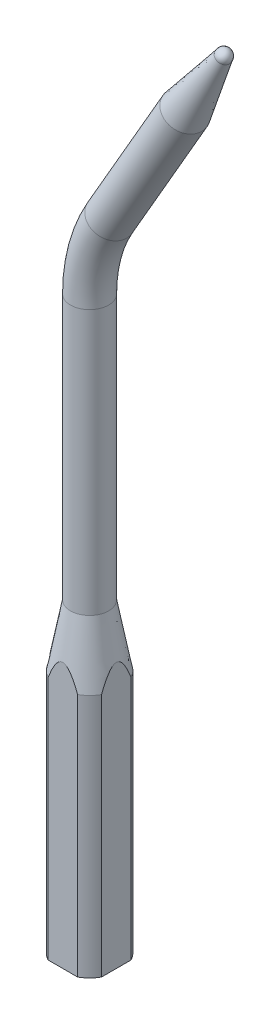
ISO-10303-21;
HEADER;
FILE_DESCRIPTION(('STEP AP214'),'2;1');
FILE_NAME('part.step','',(''),(''),'','','');
FILE_SCHEMA(('AUTOMOTIVE_DESIGN { 1 0 10303 214 1 1 1 1 }'));
ENDSEC;
DATA;
#1=APPLICATION_CONTEXT('core data for automotive mechanical design processes');
#2=APPLICATION_PROTOCOL_DEFINITION('international standard','automotive_design',2000,#1);
#3=PRODUCT_CONTEXT('',#1,'mechanical');
#4=PRODUCT('Part','Part','',(#3));
#5=PRODUCT_RELATED_PRODUCT_CATEGORY('part','',(#4));
#6=PRODUCT_DEFINITION_FORMATION('','',#4);
#7=PRODUCT_DEFINITION_CONTEXT('part definition',#1,'design');
#8=PRODUCT_DEFINITION('design','',#6,#7);
#9=PRODUCT_DEFINITION_SHAPE('','',#8);
#10=(LENGTH_UNIT() NAMED_UNIT(*) SI_UNIT(.MILLI.,.METRE.));
#11=(NAMED_UNIT(*) PLANE_ANGLE_UNIT() SI_UNIT($,.RADIAN.));
#12=(NAMED_UNIT(*) SI_UNIT($,.STERADIAN.) SOLID_ANGLE_UNIT());
#13=UNCERTAINTY_MEASURE_WITH_UNIT(LENGTH_MEASURE(1.E-05),#10,'distance_accuracy_value','');
#14=(GEOMETRIC_REPRESENTATION_CONTEXT(3) GLOBAL_UNCERTAINTY_ASSIGNED_CONTEXT((#13)) GLOBAL_UNIT_ASSIGNED_CONTEXT((#10,
#11,#12)) REPRESENTATION_CONTEXT('',''));
#15=CARTESIAN_POINT('',(0.,0.,0.));
#16=DIRECTION('',(0.,0.,1.));
#17=DIRECTION('',(1.,0.,0.));
#18=AXIS2_PLACEMENT_3D('',#15,#16,#17);
#19=CARTESIAN_POINT('',(0.,0.,0.));
#20=DIRECTION('',(0.,1.,0.));
#21=DIRECTION('',(0.,0.,1.));
#22=AXIS2_PLACEMENT_3D('',#19,#20,#21);
#23=CYLINDRICAL_SURFACE('',#22,4.);
#24=CARTESIAN_POINT('',(0.,-40.,0.));
#25=DIRECTION('',(0.,1.,0.));
#26=DIRECTION('',(0.,0.,1.));
#27=AXIS2_PLACEMENT_3D('',#24,#25,#26);
#28=CIRCLE('',#27,4.00000000000001);
#29=CARTESIAN_POINT('',(1.93649167310372,-40.,3.5));
#30=VERTEX_POINT('',#29);
#31=CARTESIAN_POINT('',(3.50000000000001,-40.,1.93649167310371));
#32=VERTEX_POINT('',#31);
#33=EDGE_CURVE('E123',#30,#32,#28,.T.);
#34=ORIENTED_EDGE('',*,*,#33,.T.);
#35=DIRECTION('',(0.,1.,0.));
#36=VECTOR('',#35,1.);
#37=CARTESIAN_POINT('',(3.50000000000001,0.,1.9364916731037));
#38=LINE('',#37,#36);
#39=CARTESIAN_POINT('',(3.50000000000001,-7.99999999999997,1.9364916731037));
#40=VERTEX_POINT('',#39);
#41=EDGE_CURVE('E212',#32,#40,#38,.T.);
#42=ORIENTED_EDGE('',*,*,#41,.T.);
#43=CARTESIAN_POINT('',(0.,-8.,0.));
#44=DIRECTION('',(0.,1.,0.));
#45=DIRECTION('',(0.,0.,1.));
#46=AXIS2_PLACEMENT_3D('',#43,#44,#45);
#47=CIRCLE('',#46,4.);
#48=CARTESIAN_POINT('',(1.93649167310372,-8.,3.5));
#49=VERTEX_POINT('',#48);
#50=EDGE_CURVE('E133',#49,#40,#47,.T.);
#51=ORIENTED_EDGE('',*,*,#50,.F.);
#52=DIRECTION('',(0.,1.,0.));
#53=VECTOR('',#52,1.);
#54=CARTESIAN_POINT('',(1.93649167310372,0.,3.5));
#55=LINE('',#54,#53);
#56=EDGE_CURVE('E260',#49,#30,#55,.F.);
#57=ORIENTED_EDGE('',*,*,#56,.T.);
#58=EDGE_LOOP('',(#34,#42,#51,#57));
#59=FACE_BOUND('',#58,.T.);
#60=ADVANCED_FACE('F33',(#59),#23,.T.);
#61=CARTESIAN_POINT('',(3.49999999999999,-8.,-1.93649167310373));
#62=VERTEX_POINT('',#61);
#63=CARTESIAN_POINT('',(1.93649167310368,-7.99999999999997,-3.50000000000001));
#64=VERTEX_POINT('',#63);
#65=EDGE_CURVE('E157',#62,#64,#47,.T.);
#66=ORIENTED_EDGE('',*,*,#65,.F.);
#67=DIRECTION('',(0.,1.,0.));
#68=VECTOR('',#67,1.);
#69=CARTESIAN_POINT('',(3.49999999999999,0.,-1.93649167310373));
#70=LINE('',#69,#68);
#71=CARTESIAN_POINT('',(3.49999999999999,-40.,-1.93649167310373));
#72=VERTEX_POINT('',#71);
#73=EDGE_CURVE('E140',#62,#72,#70,.F.);
#74=ORIENTED_EDGE('',*,*,#73,.T.);
#75=CARTESIAN_POINT('',(1.93649167310369,-40.,-3.50000000000001));
#76=VERTEX_POINT('',#75);
#77=EDGE_CURVE('E124',#72,#76,#28,.T.);
#78=ORIENTED_EDGE('',*,*,#77,.T.);
#79=DIRECTION('',(0.,1.,0.));
#80=VECTOR('',#79,1.);
#81=CARTESIAN_POINT('',(1.93649167310369,0.,-3.50000000000001));
#82=LINE('',#81,#80);
#83=EDGE_CURVE('E57',#76,#64,#82,.T.);
#84=ORIENTED_EDGE('',*,*,#83,.T.);
#85=EDGE_LOOP('',(#66,#74,#78,#84));
#86=FACE_BOUND('',#85,.T.);
#87=ADVANCED_FACE('F138',(#86),#23,.T.);
#88=CARTESIAN_POINT('',(-1.93649167310374,-8.,-3.49999999999999));
#89=VERTEX_POINT('',#88);
#90=CARTESIAN_POINT('',(-3.50000000000002,-8.,-1.93649167310368));
#91=VERTEX_POINT('',#90);
#92=EDGE_CURVE('E132',#89,#91,#47,.T.);
#93=ORIENTED_EDGE('',*,*,#92,.F.);
#94=DIRECTION('',(0.,1.,0.));
#95=VECTOR('',#94,1.);
#96=CARTESIAN_POINT('',(-1.93649167310374,0.,-3.49999999999999));
#97=LINE('',#96,#95);
#98=CARTESIAN_POINT('',(-1.93649167310374,-40.,-3.49999999999999));
#99=VERTEX_POINT('',#98);
#100=EDGE_CURVE('E169',#89,#99,#97,.F.);
#101=ORIENTED_EDGE('',*,*,#100,.T.);
#102=CARTESIAN_POINT('',(-3.50000000000002,-40.,-1.93649167310369));
#103=VERTEX_POINT('',#102);
#104=EDGE_CURVE('E120',#99,#103,#28,.T.);
#105=ORIENTED_EDGE('',*,*,#104,.T.);
#106=DIRECTION('',(0.,1.,0.));
#107=VECTOR('',#106,1.);
#108=CARTESIAN_POINT('',(-3.50000000000002,0.,-1.93649167310368));
#109=LINE('',#108,#107);
#110=EDGE_CURVE('E49',#103,#91,#109,.T.);
#111=ORIENTED_EDGE('',*,*,#110,.T.);
#112=EDGE_LOOP('',(#93,#101,#105,#111));
#113=FACE_BOUND('',#112,.T.);
#114=ADVANCED_FACE('F168',(#113),#23,.T.);
#115=CARTESIAN_POINT('',(17.5401647306339,70.3804564865854,0.));
#116=DIRECTION('',(0.,0.,1.));
#117=DIRECTION('',(1.,0.,0.));
#118=AXIS2_PLACEMENT_3D('',#115,#116,#117);
#119=SPHERICAL_SURFACE('',#118,0.919670538732358);
#120=CARTESIAN_POINT('',(17.5401647306339,70.3804564865854,0.));
#121=DIRECTION('',(0.500000000000001,0.866025403784438,0.));
#122=DIRECTION('',(-0.866025403784438,0.500000000000001,0.));
#123=AXIS2_PLACEMENT_3D('',#120,#121,#122);
#124=SPHERICAL_SURFACE('',#123,0.919670538732358);
#125=CARTESIAN_POINT('',(17.5,70.3108891324553,0.));
#126=DIRECTION('',(0.500000000000001,0.866025403784438,0.));
#127=DIRECTION('',(-0.866025403784438,0.500000000000001,0.));
#128=AXIS2_PLACEMENT_3D('',#125,#126,#127);
#129=CIRCLE('',#128,0.916155596754566);
#130=CARTESIAN_POINT('',(16.7065859793913,70.7689669308326,0.));
#131=VERTEX_POINT('',#130);
#132=EDGE_CURVE('E37',#131,#131,#129,.T.);
#133=ORIENTED_EDGE('',*,*,#132,.T.);
#134=EDGE_LOOP('',(#133));
#135=FACE_BOUND('',#134,.T.);
#136=ADVANCED_FACE('F35',(#135),#124,.T.);
#137=CARTESIAN_POINT('',(0.,0.,0.));
#138=DIRECTION('',(0.,1.,0.));
#139=DIRECTION('',(0.,0.,1.));
#140=AXIS2_PLACEMENT_3D('',#137,#138,#139);
#141=CYLINDRICAL_SURFACE('',#140,2.5);
#142=CARTESIAN_POINT('',(0.,34.6410161513775,0.));
#143=DIRECTION('',(0.,1.,0.));
#144=DIRECTION('',(0.,0.,1.));
#145=AXIS2_PLACEMENT_3D('',#142,#143,#144);
#146=CIRCLE('',#145,2.5);
#147=CARTESIAN_POINT('',(-2.5,34.6410161513775,0.));
#148=VERTEX_POINT('',#147);
#149=EDGE_CURVE('E151',#148,#148,#146,.T.);
#150=ORIENTED_EDGE('',*,*,#149,.F.);
#151=EDGE_LOOP('',(#150));
#152=FACE_BOUND('',#151,.T.);
#153=CARTESIAN_POINT('',(0.,0.,0.));
#154=DIRECTION('',(0.,1.,0.));
#155=DIRECTION('',(0.,0.,1.));
#156=AXIS2_PLACEMENT_3D('',#153,#154,#155);
#157=CIRCLE('',#156,2.5);
#158=CARTESIAN_POINT('',(0.,0.,2.5));
#159=VERTEX_POINT('',#158);
#160=EDGE_CURVE('E154',#159,#159,#157,.T.);
#161=ORIENTED_EDGE('',*,*,#160,.T.);
#162=EDGE_LOOP('',(#161));
#163=FACE_BOUND('',#162,.T.);
#164=ADVANCED_FACE('F195',(#152,#163),#141,.T.);
#165=CARTESIAN_POINT('',(20.,34.6410161513775,0.));
#166=DIRECTION('',(0.,0.,-1.));
#167=DIRECTION('',(-1.,0.,0.));
#168=AXIS2_PLACEMENT_3D('',#165,#166,#167);
#169=TOROIDAL_SURFACE('',#168,20.,2.5);
#170=CARTESIAN_POINT('',(2.67949192431124,44.6410161513776,0.));
#171=DIRECTION('',(0.500000000000001,0.866025403784438,0.));
#172=DIRECTION('',(0.,0.,1.));
#173=AXIS2_PLACEMENT_3D('',#170,#171,#172);
#174=CIRCLE('',#173,2.5);
#175=CARTESIAN_POINT('',(0.514428414850148,45.8910161513776,0.));
#176=VERTEX_POINT('',#175);
#177=EDGE_CURVE('E148',#176,#176,#174,.T.);
#178=CARTESIAN_POINT('',(20.,34.6410161513775,0.));
#179=DIRECTION('',(0.,0.,-1.));
#180=DIRECTION('',(-1.,0.,0.));
#181=AXIS2_PLACEMENT_3D('',#178,#179,#180);
#182=CIRCLE('',#181,22.5);
#183=EDGE_CURVE('',#148,#176,#182,.T.);
#184=ORIENTED_EDGE('',*,*,#149,.T.);
#185=ORIENTED_EDGE('',*,*,#177,.F.);
#186=ORIENTED_EDGE('',*,*,#183,.T.);
#187=ORIENTED_EDGE('',*,*,#183,.F.);
#188=EDGE_LOOP('',(#184,#186,#185,#187));
#189=FACE_BOUND('',#188,.T.);
#190=ADVANCED_FACE('F235',(#189),#169,.T.);
#191=CARTESIAN_POINT('',(2.67949192431124,44.6410161513776,0.));
#192=DIRECTION('',(0.500000000000001,0.866025403784438,0.));
#193=DIRECTION('',(-0.866025403784438,0.500000000000001,0.));
#194=AXIS2_PLACEMENT_3D('',#191,#192,#193);
#195=CYLINDRICAL_SURFACE('',#194,2.5);
#196=CARTESIAN_POINT('',(12.4999999999996,61.6506350946102,0.));
#197=DIRECTION('',(0.500000000000001,0.866025403784438,0.));
#198=DIRECTION('',(-0.866025403784438,0.500000000000001,0.));
#199=AXIS2_PLACEMENT_3D('',#196,#197,#198);
#200=CIRCLE('',#199,2.5);
#201=CARTESIAN_POINT('',(10.3349364905385,62.9006350946102,0.));
#202=VERTEX_POINT('',#201);
#203=EDGE_CURVE('E145',#202,#202,#200,.F.);
#204=ORIENTED_EDGE('',*,*,#203,.T.);
#205=EDGE_LOOP('',(#204));
#206=FACE_BOUND('',#205,.T.);
#207=ORIENTED_EDGE('',*,*,#177,.T.);
#208=EDGE_LOOP('',(#207));
#209=FACE_BOUND('',#208,.T.);
#210=ADVANCED_FACE('F192',(#206,#209),#195,.T.);
#211=CARTESIAN_POINT('',(0.,-8.,0.));
#212=DIRECTION('',(0.,-1.,0.));
#213=DIRECTION('',(0.,0.,-1.));
#214=AXIS2_PLACEMENT_3D('',#211,#212,#213);
#215=CONICAL_SURFACE('',#214,4.,0.185347949995695);
#216=ORIENTED_EDGE('',*,*,#160,.F.);
#217=EDGE_LOOP('',(#216));
#218=FACE_BOUND('',#217,.T.);
#219=ORIENTED_EDGE('',*,*,#50,.T.);
#220=CARTESIAN_POINT('',(3.49999999999999,-13.1285729354763,-3.51675251386879));
#221=CARTESIAN_POINT('',(3.49999999999999,-12.8936198174938,-3.45458534986749));
#222=CARTESIAN_POINT('',(3.49999999999999,-12.658860267391,-3.39167630996637));
#223=CARTESIAN_POINT('',(3.49999999999999,-12.1897998868983,-3.26404845776409));
#224=CARTESIAN_POINT('',(3.49999999999999,-11.955499123014,-3.19932940126022));
#225=CARTESIAN_POINT('',(3.49999999999999,-11.4859542672046,-3.06734001683228));
#226=CARTESIAN_POINT('',(3.49999999999999,-11.2507140910973,-3.00005572071503));
#227=CARTESIAN_POINT('',(3.49999999999999,-10.7810127103326,-2.862897933978));
#228=CARTESIAN_POINT('',(3.49999999999999,-10.5465514322992,-2.79302469524625));
#229=CARTESIAN_POINT('',(3.49999999999999,-10.0280587859841,-2.6346543492547));
#230=CARTESIAN_POINT('',(3.49999999999999,-9.74425942554378,-2.54539451948047));
#231=CARTESIAN_POINT('',(3.49999999999999,-9.17857594967459,-2.36060637978479));
#232=CARTESIAN_POINT('',(3.49999999999999,-8.89669252348532,-2.265075933448));
#233=CARTESIAN_POINT('',(3.49999999999999,-8.4767531296124,-2.11539380755752));
#234=CARTESIAN_POINT('',(3.49999999999999,-8.3375222391202,-2.06454040184272));
#235=CARTESIAN_POINT('',(3.49999999999999,-8.06006399647884,-1.96017275910516));
#236=CARTESIAN_POINT('',(3.49999999999999,-7.92183659481756,-1.90665865439797));
#237=CARTESIAN_POINT('',(3.49999999999999,-7.64677933600186,-1.79636579835434));
#238=CARTESIAN_POINT('',(3.49999999999999,-7.50994870988383,-1.73958897166379));
#239=CARTESIAN_POINT('',(3.49999999999999,-7.23810837954031,-1.62185027824733));
#240=CARTESIAN_POINT('',(3.49999999999999,-7.1030983380639,-1.56088919973033));
#241=CARTESIAN_POINT('',(3.49999999999999,-6.90721665995286,-1.46749627235053));
#242=CARTESIAN_POINT('',(3.49999999999999,-6.84530704970019,-1.43724090603593));
#243=CARTESIAN_POINT('',(3.49999999999999,-6.72218978901899,-1.37532243940288));
#244=CARTESIAN_POINT('',(3.5,-6.66098218743277,-1.34365924187296));
#245=CARTESIAN_POINT('',(3.5,-6.4782876874445,-1.24602822705264));
#246=CARTESIAN_POINT('',(3.5,-6.35810278826231,-1.17759363866689));
#247=CARTESIAN_POINT('',(3.5,-6.12682040405136,-1.03354916134846));
#248=CARTESIAN_POINT('',(3.5,-6.01555891163285,-0.958213469088596));
#249=CARTESIAN_POINT('',(3.5,-5.8565606051028,-0.835402450037115));
#250=CARTESIAN_POINT('',(3.5,-5.80498372266338,-0.792937000475108));
#251=CARTESIAN_POINT('',(3.5,-5.70560436381557,-0.703836894854997));
#252=CARTESIAN_POINT('',(3.5,-5.65779679714178,-0.657208049346528));
#253=CARTESIAN_POINT('',(3.5,-5.57882934886748,-0.570679367237503));
#254=CARTESIAN_POINT('',(3.5,-5.54645023044157,-0.531905399991131));
#255=CARTESIAN_POINT('',(3.5,-5.48629600379229,-0.450779853860896));
#256=CARTESIAN_POINT('',(3.5,-5.45852721639752,-0.408423481521683));
#257=CARTESIAN_POINT('',(3.5,-5.40929932255038,-0.319221773366203));
#258=CARTESIAN_POINT('',(3.5,-5.38794326705112,-0.272317666064612));
#259=CARTESIAN_POINT('',(3.5,-5.35494598798562,-0.175218607592903));
#260=CARTESIAN_POINT('',(3.5,-5.34327261499932,-0.125035148540981));
#261=CARTESIAN_POINT('',(3.5,-5.33251713304797,-0.0298639642940714));
#262=CARTESIAN_POINT('',(3.5,-5.33200480660281,0.0149587449370888));
#263=CARTESIAN_POINT('',(3.5,-5.34003419345308,0.103799008447085));
#264=CARTESIAN_POINT('',(3.5,-5.34858556263111,0.147815653128732));
#265=CARTESIAN_POINT('',(3.5,-5.37470344509407,0.23788764732965));
#266=CARTESIAN_POINT('',(3.5,-5.39309857314768,0.283694864240399));
#267=CARTESIAN_POINT('',(3.5,-5.43688593142311,0.37177983073817));
#268=CARTESIAN_POINT('',(3.5,-5.46228925691264,0.414051843990722));
#269=CARTESIAN_POINT('',(3.5,-5.53948535826397,0.526479011622197));
#270=CARTESIAN_POINT('',(3.5,-5.59651919290448,0.592990928886778));
#271=CARTESIAN_POINT('',(3.5,-5.68827158590267,0.686449140766235));
#272=CARTESIAN_POINT('',(3.5,-5.71997056770298,0.716613200923355));
#273=CARTESIAN_POINT('',(3.5,-5.78500484556431,0.775119662495007));
#274=CARTESIAN_POINT('',(3.5,-5.81833938635572,0.803462891027552));
#275=CARTESIAN_POINT('',(3.5,-5.92230023123547,0.887854393979954));
#276=CARTESIAN_POINT('',(3.5,-5.99495896301737,0.941382676836694));
#277=CARTESIAN_POINT('',(3.5,-6.14365276038494,1.04356721238955));
#278=CARTESIAN_POINT('',(3.5,-6.21969092950775,1.09221884731216));
#279=CARTESIAN_POINT('',(3.5,-6.3742688573294,1.18587923991362));
#280=CARTESIAN_POINT('',(3.5,-6.45281531570568,1.23087686270959));
#281=CARTESIAN_POINT('',(3.5,-6.61156139954763,1.31786844421471));
#282=CARTESIAN_POINT('',(3.5,-6.69176138427417,1.35986174112454));
#283=CARTESIAN_POINT('',(3.5,-6.93650867676595,1.48339874139074));
#284=CARTESIAN_POINT('',(3.5,-7.10295112669783,1.56118765679534));
#285=CARTESIAN_POINT('',(3.50000000000001,-7.35466353498216,1.67264456607165));
#286=CARTESIAN_POINT('',(3.50000000000001,-7.43882538233244,1.708892714654));
#287=CARTESIAN_POINT('',(3.50000000000001,-7.6077700481962,1.77990974962147));
#288=CARTESIAN_POINT('',(3.50000000000001,-7.69255283994323,1.8146786993342));
#289=CARTESIAN_POINT('',(3.50000000000001,-7.95251036230225,1.91903884333557));
#290=CARTESIAN_POINT('',(3.50000000000001,-8.12850296261979,1.98659030435029));
#291=CARTESIAN_POINT('',(3.50000000000001,-8.48200133381771,2.11762901089349));
#292=CARTESIAN_POINT('',(3.50000000000001,-8.65950725460568,2.18111584835797));
#293=CARTESIAN_POINT('',(3.50000000000001,-9.015690852264,2.30489049446189));
#294=CARTESIAN_POINT('',(3.50000000000001,-9.19436888486505,2.3651772761394));
#295=CARTESIAN_POINT('',(3.50000000000001,-9.55258758686098,2.48313690400216));
#296=CARTESIAN_POINT('',(3.50000000000001,-9.73212827992475,2.54080967800848));
#297=CARTESIAN_POINT('',(3.50000000000001,-10.2726206870177,2.71087716730616));
#298=CARTESIAN_POINT('',(3.50000000000001,-10.6345918283283,2.82003079224866));
#299=CARTESIAN_POINT('',(3.50000000000001,-11.3602518373446,3.03214671866686));
#300=CARTESIAN_POINT('',(3.50000000000001,-11.7239403719408,3.13511017156969));
#301=CARTESIAN_POINT('',(3.50000000000001,-12.4152638849416,3.32605500530746));
#302=CARTESIAN_POINT('',(3.50000000000001,-12.7427738749736,3.41449037223266));
#303=CARTESIAN_POINT('',(3.50000000000001,-13.3986082577783,3.58835786774364));
#304=CARTESIAN_POINT('',(3.50000000000001,-13.7269326966477,3.67378982198715));
#305=CARTESIAN_POINT('',(3.50000000000001,-14.382834808912,3.84185003374587));
#306=CARTESIAN_POINT('',(3.50000000000001,-14.7104098688318,3.92448851627452));
#307=CARTESIAN_POINT('',(3.50000000000001,-15.3660404283354,4.08771699379822));
#308=CARTESIAN_POINT('',(3.50000000000001,-15.6940958840969,4.16830716466156));
#309=CARTESIAN_POINT('',(3.50000000000001,-16.0223492733938,4.24807167272054));
#310=B_SPLINE_CURVE_WITH_KNOTS('',3,(#220,#221,#222,#223,#224,#225,#226,#227,#228,#229,#230,
#231,#232,#233,#234,#235,#236,#237,#238,#239,#240,#241,#242,#243,#244,#245,#246,#247,#248,#249,
#250,#251,#252,#253,#254,#255,#256,#257,#258,#259,#260,#261,#262,#263,#264,#265,#266,#267,#268,
#269,#270,#271,#272,#273,#274,#275,#276,#277,#278,#279,#280,#281,#282,#283,#284,#285,#286,#287,
#288,#289,#290,#291,#292,#293,#294,#295,#296,#297,#298,#299,#300,#301,#302,#303,#304,#305,#306,
#307,#308,#309),.UNSPECIFIED.,.F.,.F.,(4,2,2,2,2,2,2,2,2,2,2,2,2,2,2,2,2,2,2,2,2,2,2,2,2,2,2,2,
2,2,2,2,2,2,2,2,2,2,2,2,2,2,2,2,4),(0.,0.729118275799571,1.45833540145195,2.19234345427321,
2.92628027923383,3.81874918896225,4.7115237594619,5.15618509038657,5.60082433054317,
6.04520392264086,6.48950003321507,6.69620629437323,6.9029268509404,7.31760393243595,
7.71993837653773,7.92020929922357,8.1202049613275,8.27150601228364,8.42301281610399,
8.57683793725928,8.73015024475336,8.86368204732403,8.99735624927076,9.14462916852698,
9.29213659939421,9.55342333704923,9.68468050459431,9.81587762032703,10.0863091550805,
10.3569943933735,10.6284757424093,10.9000167109677,11.4509034050748,11.7258067551044,
12.0006983240779,12.5661593176139,13.1316769913328,13.6973750671555,14.2630887537365,
15.3972124616216,16.5311245555086,17.5488261168098,18.5665866564928,19.5800938034589,
20.5935136345888),.UNSPECIFIED.);
#311=EDGE_CURVE('E207',#40,#62,#310,.F.);
#312=ORIENTED_EDGE('',*,*,#311,.T.);
#313=ORIENTED_EDGE('',*,*,#65,.T.);
#314=CARTESIAN_POINT('',(-3.5167525138688,-13.1285729354763,-3.49999999999998));
#315=CARTESIAN_POINT('',(-3.4545853498675,-12.8936198174938,-3.49999999999998));
#316=CARTESIAN_POINT('',(-3.39167630996639,-12.658860267391,-3.49999999999998));
#317=CARTESIAN_POINT('',(-3.26404845776411,-12.1897998868983,-3.49999999999998));
#318=CARTESIAN_POINT('',(-3.19932940126023,-11.9554991230141,-3.49999999999998));
#319=CARTESIAN_POINT('',(-3.06734001683229,-11.4859542672047,-3.49999999999998));
#320=CARTESIAN_POINT('',(-3.00005572071505,-11.2507140910974,-3.49999999999998));
#321=CARTESIAN_POINT('',(-2.86289793397802,-10.7810127103326,-3.49999999999998));
#322=CARTESIAN_POINT('',(-2.79302469524627,-10.5465514322992,-3.49999999999998));
#323=CARTESIAN_POINT('',(-2.63465434925472,-10.0280587859841,-3.49999999999998));
#324=CARTESIAN_POINT('',(-2.54539451948049,-9.7442594255438,-3.49999999999998));
#325=CARTESIAN_POINT('',(-2.36060637978481,-9.17857594967461,-3.49999999999998));
#326=CARTESIAN_POINT('',(-2.26507593344802,-8.89669252348534,-3.49999999999998));
#327=CARTESIAN_POINT('',(-2.11539380755754,-8.47675312961242,-3.49999999999999));
#328=CARTESIAN_POINT('',(-2.06454040184274,-8.33752223912021,-3.49999999999999));
#329=CARTESIAN_POINT('',(-1.96017275910517,-8.06006399647885,-3.49999999999999));
#330=CARTESIAN_POINT('',(-1.90665865439798,-7.92183659481757,-3.49999999999999));
#331=CARTESIAN_POINT('',(-1.79636579835436,-7.64677933600186,-3.49999999999999));
#332=CARTESIAN_POINT('',(-1.7395889716638,-7.50994870988383,-3.49999999999999));
#333=CARTESIAN_POINT('',(-1.62185027824735,-7.23810837954031,-3.49999999999999));
#334=CARTESIAN_POINT('',(-1.56088919973034,-7.10309833806389,-3.49999999999999));
#335=CARTESIAN_POINT('',(-1.46749627235054,-6.90721665995286,-3.49999999999999));
#336=CARTESIAN_POINT('',(-1.43724090603594,-6.84530704970019,-3.49999999999999));
#337=CARTESIAN_POINT('',(-1.37532243940289,-6.72218978901899,-3.49999999999999));
#338=CARTESIAN_POINT('',(-1.34365924187297,-6.66098218743276,-3.49999999999999));
#339=CARTESIAN_POINT('',(-1.24602822705265,-6.4782876874445,-3.49999999999999));
#340=CARTESIAN_POINT('',(-1.17759363866689,-6.35810278826231,-3.49999999999999));
#341=CARTESIAN_POINT('',(-1.03354916134847,-6.12682040405136,-3.49999999999999));
#342=CARTESIAN_POINT('',(-0.958213469088606,-6.01555891163285,-3.49999999999999));
#343=CARTESIAN_POINT('',(-0.835402450037125,-5.8565606051028,-3.49999999999999));
#344=CARTESIAN_POINT('',(-0.792937000475117,-5.80498372266338,-3.49999999999999));
#345=CARTESIAN_POINT('',(-0.703836894855008,-5.70560436381557,-3.5));
#346=CARTESIAN_POINT('',(-0.657208049346539,-5.65779679714178,-3.5));
#347=CARTESIAN_POINT('',(-0.570679367237514,-5.57882934886748,-3.5));
#348=CARTESIAN_POINT('',(-0.531905399991141,-5.54645023044157,-3.5));
#349=CARTESIAN_POINT('',(-0.450779853860905,-5.4862960037923,-3.5));
#350=CARTESIAN_POINT('',(-0.408423481521692,-5.45852721639752,-3.5));
#351=CARTESIAN_POINT('',(-0.319221773366211,-5.40929932255039,-3.5));
#352=CARTESIAN_POINT('',(-0.272317666064621,-5.38794326705112,-3.5));
#353=CARTESIAN_POINT('',(-0.175218607592912,-5.35494598798563,-3.5));
#354=CARTESIAN_POINT('',(-0.12503514854099,-5.34327261499932,-3.5));
#355=CARTESIAN_POINT('',(-0.0298639642940812,-5.33251713304797,-3.5));
#356=CARTESIAN_POINT('',(0.014958744937079,-5.33200480660282,-3.5));
#357=CARTESIAN_POINT('',(0.103799008447076,-5.34003419345308,-3.5));
#358=CARTESIAN_POINT('',(0.147815653128722,-5.34858556263112,-3.5));
#359=CARTESIAN_POINT('',(0.23788764732964,-5.37470344509408,-3.5));
#360=CARTESIAN_POINT('',(0.283694864240389,-5.39309857314768,-3.5));
#361=CARTESIAN_POINT('',(0.37177983073816,-5.43688593142312,-3.5));
#362=CARTESIAN_POINT('',(0.414051843990712,-5.46228925691265,-3.5));
#363=CARTESIAN_POINT('',(0.526479011622188,-5.53948535826398,-3.5));
#364=CARTESIAN_POINT('',(0.592990928886771,-5.59651919290449,-3.5));
#365=CARTESIAN_POINT('',(0.686449140766228,-5.68827158590268,-3.50000000000001));
#366=CARTESIAN_POINT('',(0.716613200923348,-5.71997056770299,-3.50000000000001));
#367=CARTESIAN_POINT('',(0.775119662494999,-5.78500484556432,-3.50000000000001));
#368=CARTESIAN_POINT('',(0.803462891027543,-5.81833938635573,-3.50000000000001));
#369=CARTESIAN_POINT('',(0.887854393979946,-5.92230023123548,-3.50000000000001));
#370=CARTESIAN_POINT('',(0.941382676836688,-5.99495896301738,-3.50000000000001));
#371=CARTESIAN_POINT('',(1.04356721238955,-6.14365276038495,-3.50000000000001));
#372=CARTESIAN_POINT('',(1.09221884731216,-6.21969092950777,-3.50000000000001));
#373=CARTESIAN_POINT('',(1.18587923991362,-6.37426885732942,-3.50000000000001));
#374=CARTESIAN_POINT('',(1.23087686270959,-6.4528153157057,-3.50000000000001));
#375=CARTESIAN_POINT('',(1.31786844421471,-6.61156139954765,-3.50000000000001));
#376=CARTESIAN_POINT('',(1.35986174112454,-6.6917613842742,-3.50000000000001));
#377=CARTESIAN_POINT('',(1.48339874139073,-6.93650867676598,-3.50000000000001));
#378=CARTESIAN_POINT('',(1.56118765679534,-7.10295112669785,-3.50000000000001));
#379=CARTESIAN_POINT('',(1.67264456607165,-7.35466353498219,-3.50000000000001));
#380=CARTESIAN_POINT('',(1.708892714654,-7.43882538233247,-3.50000000000001));
#381=CARTESIAN_POINT('',(1.77990974962147,-7.60777004819624,-3.50000000000001));
#382=CARTESIAN_POINT('',(1.8146786993342,-7.69255283994327,-3.50000000000001));
#383=CARTESIAN_POINT('',(1.91903884333557,-7.95251036230229,-3.50000000000001));
#384=CARTESIAN_POINT('',(1.98659030435029,-8.12850296261982,-3.50000000000001));
#385=CARTESIAN_POINT('',(2.11762901089349,-8.48200133381775,-3.50000000000002));
#386=CARTESIAN_POINT('',(2.18111584835797,-8.65950725460572,-3.50000000000002));
#387=CARTESIAN_POINT('',(2.3048904944619,-9.01569085226405,-3.50000000000002));
#388=CARTESIAN_POINT('',(2.36517727613941,-9.1943688848651,-3.50000000000002));
#389=CARTESIAN_POINT('',(2.48313690400217,-9.55258758686103,-3.50000000000002));
#390=CARTESIAN_POINT('',(2.54080967800848,-9.7321282799248,-3.50000000000002));
#391=CARTESIAN_POINT('',(2.71087716730617,-10.2726206870177,-3.50000000000002));
#392=CARTESIAN_POINT('',(2.82003079224867,-10.6345918283284,-3.50000000000002));
#393=CARTESIAN_POINT('',(3.03214671866687,-11.3602518373447,-3.50000000000002));
#394=CARTESIAN_POINT('',(3.1351101715697,-11.7239403719409,-3.50000000000002));
#395=CARTESIAN_POINT('',(3.32605500530747,-12.4152638849417,-3.50000000000002));
#396=CARTESIAN_POINT('',(3.41449037223267,-12.7427738749737,-3.50000000000002));
#397=CARTESIAN_POINT('',(3.58835786774366,-13.3986082577784,-3.50000000000003));
#398=CARTESIAN_POINT('',(3.67378982198716,-13.7269326966478,-3.50000000000003));
#399=CARTESIAN_POINT('',(3.84185003374589,-14.3828348089121,-3.50000000000003));
#400=CARTESIAN_POINT('',(3.92448851627453,-14.7104098688319,-3.50000000000003));
#401=CARTESIAN_POINT('',(4.08771699379824,-15.3660404283355,-3.50000000000003));
#402=CARTESIAN_POINT('',(4.16830716466157,-15.694095884097,-3.50000000000003));
#403=CARTESIAN_POINT('',(4.24807167272056,-16.0223492733939,-3.50000000000003));
#404=B_SPLINE_CURVE_WITH_KNOTS('',3,(#314,#315,#316,#317,#318,#319,#320,#321,#322,#323,#324,
#325,#326,#327,#328,#329,#330,#331,#332,#333,#334,#335,#336,#337,#338,#339,#340,#341,#342,#343,
#344,#345,#346,#347,#348,#349,#350,#351,#352,#353,#354,#355,#356,#357,#358,#359,#360,#361,#362,
#363,#364,#365,#366,#367,#368,#369,#370,#371,#372,#373,#374,#375,#376,#377,#378,#379,#380,#381,
#382,#383,#384,#385,#386,#387,#388,#389,#390,#391,#392,#393,#394,#395,#396,#397,#398,#399,#400,
#401,#402,#403),.UNSPECIFIED.,.F.,.F.,(4,2,2,2,2,2,2,2,2,2,2,2,2,2,2,2,2,2,2,2,2,2,2,2,2,2,2,2,
2,2,2,2,2,2,2,2,2,2,2,2,2,2,2,2,4),(0.,0.729118275799562,1.45833540145193,2.19234345427319,
2.9262802792338,3.81874918896223,4.71152375946189,5.15618509038656,5.60082433054317,
6.04520392264086,6.48950003321508,6.69620629437323,6.9029268509404,7.31760393243596,
7.71993837653774,7.92020929922357,8.1202049613275,8.27150601228364,8.42301281610399,
8.57683793725928,8.73015024475336,8.86368204732403,8.99735624927076,9.14462916852698,
9.29213659939422,9.55342333704923,9.68468050459431,9.81587762032703,10.0863091550805,
10.3569943933735,10.6284757424093,10.9000167109677,11.4509034050748,11.7258067551044,
12.0006983240779,12.566159317614,13.1316769913329,13.6973750671556,14.2630887537365,
15.3972124616217,16.5311245555086,17.5488261168099,18.5665866564929,19.580093803459,
20.593513634589),.UNSPECIFIED.);
#405=EDGE_CURVE('E166',#64,#89,#404,.F.);
#406=ORIENTED_EDGE('',*,*,#405,.T.);
#407=ORIENTED_EDGE('',*,*,#92,.T.);
#408=CARTESIAN_POINT('',(-3.50000000000004,-13.1057191724202,-3.5107043211496));
#409=CARTESIAN_POINT('',(-3.50000000000003,-12.8721343998945,-3.448846339739));
#410=CARTESIAN_POINT('',(-3.50000000000003,-12.6387421522032,-3.38625119230059));
#411=CARTESIAN_POINT('',(-3.50000000000003,-12.1724128784236,-3.2592639607065));
#412=CARTESIAN_POINT('',(-3.50000000000003,-11.9394759195649,-3.19487162988811));
#413=CARTESIAN_POINT('',(-3.50000000000003,-11.4726276611673,-3.06354429083602));
#414=CARTESIAN_POINT('',(-3.50000000000003,-11.23872034122,-2.99659509736739));
#415=CARTESIAN_POINT('',(-3.50000000000003,-10.7716794874039,-2.86012887908985));
#416=CARTESIAN_POINT('',(-3.50000000000003,-10.538545878725,-2.79061211091886));
#417=CARTESIAN_POINT('',(-3.50000000000003,-10.0203894115916,-2.63227054052401));
#418=CARTESIAN_POINT('',(-3.50000000000003,-9.73560963338985,-2.54264694259623));
#419=CARTESIAN_POINT('',(-3.50000000000002,-9.16798398195179,-2.35706510528439));
#420=CARTESIAN_POINT('',(-3.50000000000002,-8.88513882995076,-2.26110463189229));
#421=CARTESIAN_POINT('',(-3.50000000000002,-8.46381142031954,-2.11070343127935));
#422=CARTESIAN_POINT('',(-3.50000000000002,-8.32413773654397,-2.05960246481555));
#423=CARTESIAN_POINT('',(-3.50000000000002,-8.04580953484525,-1.95470361927157));
#424=CARTESIAN_POINT('',(-3.50000000000002,-7.90715496527331,-1.90090587795989));
#425=CARTESIAN_POINT('',(-3.50000000000002,-7.63126976948397,-1.78999703390785));
#426=CARTESIAN_POINT('',(-3.50000000000002,-7.49403833342496,-1.7328879530407));
#427=CARTESIAN_POINT('',(-3.50000000000002,-7.22143397835352,-1.61441321998402));
#428=CARTESIAN_POINT('',(-3.50000000000002,-7.08606070247051,-1.55304839923409));
#429=CARTESIAN_POINT('',(-3.50000000000001,-6.88987299243267,-1.45906838365338));
#430=CARTESIAN_POINT('',(-3.50000000000001,-6.8279933136342,-1.42867645510406));
#431=CARTESIAN_POINT('',(-3.50000000000001,-6.70495034711118,-1.36646304557386));
#432=CARTESIAN_POINT('',(-3.50000000000001,-6.6437871124372,-1.33464145956419));
#433=CARTESIAN_POINT('',(-3.50000000000001,-6.46123200002666,-1.23648139028269));
#434=CARTESIAN_POINT('',(-3.50000000000001,-6.34117229321398,-1.16763420264405));
#435=CARTESIAN_POINT('',(-3.50000000000001,-6.11046887189247,-1.02270168943652));
#436=CARTESIAN_POINT('',(-3.50000000000001,-5.99964808438892,-0.946910206992599));
#437=CARTESIAN_POINT('',(-3.50000000000001,-5.84157498429764,-0.823230496672771));
#438=CARTESIAN_POINT('',(-3.50000000000001,-5.79035629134682,-0.780452483195324));
#439=CARTESIAN_POINT('',(-3.50000000000001,-5.6918329928084,-0.690645220396141));
#440=CARTESIAN_POINT('',(-3.50000000000001,-5.64452273508283,-0.64362232342343));
#441=CARTESIAN_POINT('',(-3.5,-5.56701656689792,-0.556746218663181));
#442=CARTESIAN_POINT('',(-3.5,-5.53551278971751,-0.518073761749427));
#443=CARTESIAN_POINT('',(-3.5,-5.47718734551468,-0.437199727050096));
#444=CARTESIAN_POINT('',(-3.5,-5.45037133594765,-0.394993974660882));
#445=CARTESIAN_POINT('',(-3.5,-5.40312974017332,-0.306196334470235));
#446=CARTESIAN_POINT('',(-3.5,-5.38280818727914,-0.259547226262399));
#447=CARTESIAN_POINT('',(-3.5,-5.35186038693927,-0.163143833709586));
#448=CARTESIAN_POINT('',(-3.5,-5.34120380734132,-0.113399791264594));
#449=CARTESIAN_POINT('',(-3.5,-5.33217090749222,-0.0194691694680823));
#450=CARTESIAN_POINT('',(-3.5,-5.33234969031878,0.0245765271831079));
#451=CARTESIAN_POINT('',(-3.5,-5.34139919346305,0.111778151468517));
#452=CARTESIAN_POINT('',(-3.5,-5.35027964751127,0.154933027425968));
#453=CARTESIAN_POINT('',(-3.5,-5.37711753325642,0.244542009529484));
#454=CARTESIAN_POINT('',(-3.5,-5.39612437830799,0.290672445462921));
#455=CARTESIAN_POINT('',(-3.49999999999999,-5.44115583804818,0.379315591540266));
#456=CARTESIAN_POINT('',(-3.49999999999999,-5.46719200351471,0.421822194268162));
#457=CARTESIAN_POINT('',(-3.49999999999999,-5.54659076614862,0.535497438392892));
#458=CARTESIAN_POINT('',(-3.49999999999999,-5.60532357982895,0.602868703723803));
#459=CARTESIAN_POINT('',(-3.49999999999999,-5.69966220970995,0.697475665994935));
#460=CARTESIAN_POINT('',(-3.49999999999999,-5.73223243172063,0.728000542583838));
#461=CARTESIAN_POINT('',(-3.49999999999999,-5.79901687060071,0.787192132509782));
#462=CARTESIAN_POINT('',(-3.49999999999999,-5.83323030651596,0.815859713622408));
#463=CARTESIAN_POINT('',(-3.49999999999999,-5.94124973724052,0.902296899111627));
#464=CARTESIAN_POINT('',(-3.49999999999999,-6.01719412701975,0.957376521160025));
#465=CARTESIAN_POINT('',(-3.49999999999999,-6.17255864147034,1.06243934927615));
#466=CARTESIAN_POINT('',(-3.49999999999999,-6.2519820374468,1.11241760485216));
#467=CARTESIAN_POINT('',(-3.49999999999999,-6.41339558847729,1.20858650318594));
#468=CARTESIAN_POINT('',(-3.49999999999999,-6.49539270858337,1.25476537320273));
#469=CARTESIAN_POINT('',(-3.49999999999998,-6.66106961025555,1.34401320247421));
#470=CARTESIAN_POINT('',(-3.49999999999998,-6.74474975675874,1.38708147774624));
#471=CARTESIAN_POINT('',(-3.49999999999998,-7.00005275124389,1.51375348863509));
#472=CARTESIAN_POINT('',(-3.49999999999998,-7.17359694438483,1.59348417964776));
#473=CARTESIAN_POINT('',(-3.49999999999998,-7.4359715416793,1.70771515311861));
#474=CARTESIAN_POINT('',(-3.49999999999998,-7.52368394310377,1.74486344733422));
#475=CARTESIAN_POINT('',(-3.49999999999998,-7.69973457576209,1.81764375284165));
#476=CARTESIAN_POINT('',(-3.49999999999998,-7.78807277956921,1.85327583011024));
#477=CARTESIAN_POINT('',(-3.49999999999998,-8.05877674960021,1.96017930478329));
#478=CARTESIAN_POINT('',(-3.49999999999998,-8.24196421034244,2.02936735102202));
#479=CARTESIAN_POINT('',(-3.49999999999998,-8.60985756989095,2.16359994531765));
#480=CARTESIAN_POINT('',(-3.49999999999998,-8.79456361381467,2.22864409205848));
#481=CARTESIAN_POINT('',(-3.49999999999997,-9.16515028298506,2.3554761632207));
#482=CARTESIAN_POINT('',(-3.49999999999997,-9.35103125235797,2.417263078937));
#483=CARTESIAN_POINT('',(-3.49999999999997,-9.7236570440356,2.538180576078));
#484=CARTESIAN_POINT('',(-3.49999999999997,-9.91040188905549,2.59731108721096));
#485=CARTESIAN_POINT('',(-3.49999999999997,-10.4725265033761,2.77170604491679));
#486=CARTESIAN_POINT('',(-3.49999999999997,-10.8489262234141,2.88368155755058));
#487=CARTESIAN_POINT('',(-3.49999999999997,-11.6034422771801,3.10136378545888));
#488=CARTESIAN_POINT('',(-3.49999999999997,-11.9815582895515,3.20707162606308));
#489=CARTESIAN_POINT('',(-3.49999999999996,-12.7006873477394,3.40329322782651));
#490=CARTESIAN_POINT('',(-3.49999999999996,-13.0415768761312,3.49426110266967));
#491=CARTESIAN_POINT('',(-3.49999999999996,-13.7241706680721,3.67315812939354));
#492=CARTESIAN_POINT('',(-3.49999999999996,-14.0658749762054,3.76108711070967));
#493=CARTESIAN_POINT('',(-3.49999999999996,-14.7485198855251,3.93411576124555));
#494=CARTESIAN_POINT('',(-3.49999999999996,-15.0894579464351,4.01922547692444));
#495=CARTESIAN_POINT('',(-3.49999999999996,-15.7718139549021,4.18737758210939));
#496=CARTESIAN_POINT('',(-3.49999999999995,-16.1132318603537,4.27042014233444));
#497=CARTESIAN_POINT('',(-3.49999999999995,-16.4548472800301,4.35263091160884));
#498=B_SPLINE_CURVE_WITH_KNOTS('',3,(#408,#409,#410,#411,#412,#413,#414,#415,#416,#417,#418,
#419,#420,#421,#422,#423,#424,#425,#426,#427,#428,#429,#430,#431,#432,#433,#434,#435,#436,#437,
#438,#439,#440,#441,#442,#443,#444,#445,#446,#447,#448,#449,#450,#451,#452,#453,#454,#455,#456,
#457,#458,#459,#460,#461,#462,#463,#464,#465,#466,#467,#468,#469,#470,#471,#472,#473,#474,#475,
#476,#477,#478,#479,#480,#481,#482,#483,#484,#485,#486,#487,#488,#489,#490,#491,#492,#493,#494,
#495,#496,#497),.UNSPECIFIED.,.F.,.F.,(4,2,2,2,2,2,2,2,2,2,2,2,2,2,2,2,2,2,2,2,2,2,2,2,2,2,2,2,
2,2,2,2,2,2,2,2,2,2,2,2,2,2,2,2,4),(0.,0.724912517318578,1.44992502267756,2.17981233457255,
2.90962688810985,3.80522827306641,4.70114709739527,5.1473105833137,5.59345129952871,
6.03932241777769,6.48510667070438,6.69191207137479,6.89873268978238,7.31368984225161,
7.71566456745414,7.91569883122992,8.11543856052187,8.26482732140476,8.41439514651787,
8.56625099587623,8.71762860119863,8.84887095500786,8.98026028492352,9.12910995094948,
9.27820571553664,9.54474552682268,9.67864754378454,9.81248654029935,10.0936052900067,
10.3749943012198,10.6572247322346,10.9395170345957,11.5121799585515,11.7979397530276,
12.0836871001887,12.6710671935376,13.2585040855264,13.8461218400497,14.4337551345156,
15.6117747383262,16.7895821900105,17.8480199728459,18.9065170666702,19.9607122389536,
21.0148200582178),.UNSPECIFIED.);
#499=CARTESIAN_POINT('',(-3.49999999999998,-8.,1.93649167310376));
#500=VERTEX_POINT('',#499);
#501=EDGE_CURVE('E114',#91,#500,#498,.T.);
#502=ORIENTED_EDGE('',*,*,#501,.T.);
#503=CARTESIAN_POINT('',(-1.93649167310371,-8.,3.5));
#504=VERTEX_POINT('',#503);
#505=EDGE_CURVE('E113',#500,#504,#47,.T.);
#506=ORIENTED_EDGE('',*,*,#505,.T.);
#507=CARTESIAN_POINT('',(-3.51070432114963,-13.1057191724202,3.5));
#508=CARTESIAN_POINT('',(-3.44884633973904,-12.8721343998945,3.5));
#509=CARTESIAN_POINT('',(-3.38625119230062,-12.6387421522032,3.5));
#510=CARTESIAN_POINT('',(-3.25926396070654,-12.1724128784236,3.5));
#511=CARTESIAN_POINT('',(-3.19487162988815,-11.9394759195649,3.5));
#512=CARTESIAN_POINT('',(-3.06354429083605,-11.4726276611673,3.5));
#513=CARTESIAN_POINT('',(-2.99659509736743,-11.23872034122,3.5));
#514=CARTESIAN_POINT('',(-2.8601288790899,-10.7716794874039,3.5));
#515=CARTESIAN_POINT('',(-2.7906121109189,-10.538545878725,3.5));
#516=CARTESIAN_POINT('',(-2.63227054052405,-10.0203894115916,3.5));
#517=CARTESIAN_POINT('',(-2.54264694259627,-9.73560963338987,3.5));
#518=CARTESIAN_POINT('',(-2.35706510528443,-9.16798398195181,3.5));
#519=CARTESIAN_POINT('',(-2.26110463189233,-8.88513882995078,3.5));
#520=CARTESIAN_POINT('',(-2.11070343127939,-8.46381142031955,3.5));
#521=CARTESIAN_POINT('',(-2.05960246481559,-8.32413773654398,3.5));
#522=CARTESIAN_POINT('',(-1.9547036192716,-8.04580953484525,3.5));
#523=CARTESIAN_POINT('',(-1.90090587795993,-7.90715496527332,3.5));
#524=CARTESIAN_POINT('',(-1.78999703390789,-7.63126976948397,3.5));
#525=CARTESIAN_POINT('',(-1.73288795304074,-7.49403833342497,3.5));
#526=CARTESIAN_POINT('',(-1.61441321998405,-7.22143397835352,3.5));
#527=CARTESIAN_POINT('',(-1.55304839923413,-7.08606070247051,3.5));
#528=CARTESIAN_POINT('',(-1.45906838365342,-6.88987299243267,3.5));
#529=CARTESIAN_POINT('',(-1.4286764551041,-6.82799331363421,3.5));
#530=CARTESIAN_POINT('',(-1.3664630455739,-6.70495034711118,3.5));
#531=CARTESIAN_POINT('',(-1.33464145956422,-6.6437871124372,3.5));
#532=CARTESIAN_POINT('',(-1.23648139028273,-6.46123200002666,3.5));
#533=CARTESIAN_POINT('',(-1.16763420264409,-6.34117229321398,3.5));
#534=CARTESIAN_POINT('',(-1.02270168943655,-6.11046887189247,3.5));
#535=CARTESIAN_POINT('',(-0.946910206992633,-5.99964808438892,3.5));
#536=CARTESIAN_POINT('',(-0.823230496672804,-5.84157498429764,3.5));
#537=CARTESIAN_POINT('',(-0.780452483195357,-5.79035629134682,3.5));
#538=CARTESIAN_POINT('',(-0.690645220396174,-5.6918329928084,3.5));
#539=CARTESIAN_POINT('',(-0.643622323423463,-5.64452273508283,3.5));
#540=CARTESIAN_POINT('',(-0.556746218663214,-5.56701656689792,3.5));
#541=CARTESIAN_POINT('',(-0.51807376174946,-5.53551278971751,3.5));
#542=CARTESIAN_POINT('',(-0.437199727050129,-5.47718734551468,3.5));
#543=CARTESIAN_POINT('',(-0.394993974660915,-5.45037133594765,3.5));
#544=CARTESIAN_POINT('',(-0.306196334470269,-5.40312974017333,3.5));
#545=CARTESIAN_POINT('',(-0.259547226262433,-5.38280818727915,3.5));
#546=CARTESIAN_POINT('',(-0.163143833709621,-5.35186038693927,3.5));
#547=CARTESIAN_POINT('',(-0.113399791264629,-5.34120380734132,3.5));
#548=CARTESIAN_POINT('',(-0.0194691694681176,-5.33217090749222,3.5));
#549=CARTESIAN_POINT('',(0.0245765271830725,-5.33234969031878,3.5));
#550=CARTESIAN_POINT('',(0.111778151468481,-5.34139919346306,3.5));
#551=CARTESIAN_POINT('',(0.154933027425933,-5.35027964751127,3.5));
#552=CARTESIAN_POINT('',(0.244542009529449,-5.37711753325643,3.5));
#553=CARTESIAN_POINT('',(0.290672445462886,-5.396124378308,3.5));
#554=CARTESIAN_POINT('',(0.379315591540232,-5.44115583804818,3.5));
#555=CARTESIAN_POINT('',(0.421822194268127,-5.46719200351472,3.5));
#556=CARTESIAN_POINT('',(0.535497438392856,-5.54659076614862,3.5));
#557=CARTESIAN_POINT('',(0.602868703723767,-5.60532357982896,3.5));
#558=CARTESIAN_POINT('',(0.6974756659949,-5.69966220970996,3.5));
#559=CARTESIAN_POINT('',(0.728000542583804,-5.73223243172064,3.5));
#560=CARTESIAN_POINT('',(0.787192132509748,-5.79901687060072,3.5));
#561=CARTESIAN_POINT('',(0.815859713622373,-5.83323030651597,3.5));
#562=CARTESIAN_POINT('',(0.902296899111592,-5.94124973724053,3.5));
#563=CARTESIAN_POINT('',(0.95737652115999,-6.01719412701976,3.5));
#564=CARTESIAN_POINT('',(1.06243934927611,-6.17255864147035,3.5));
#565=CARTESIAN_POINT('',(1.11241760485212,-6.25198203744682,3.5));
#566=CARTESIAN_POINT('',(1.2085865031859,-6.4133955884773,3.5));
#567=CARTESIAN_POINT('',(1.2547653732027,-6.49539270858339,3.5));
#568=CARTESIAN_POINT('',(1.34401320247418,-6.66106961025556,3.5));
#569=CARTESIAN_POINT('',(1.38708147774621,-6.74474975675875,3.5));
#570=CARTESIAN_POINT('',(1.51375348863506,-7.00005275124391,3.5));
#571=CARTESIAN_POINT('',(1.59348417964773,-7.17359694438484,3.5));
#572=CARTESIAN_POINT('',(1.70771515311858,-7.43597154167932,3.5));
#573=CARTESIAN_POINT('',(1.74486344733419,-7.52368394310379,3.5));
#574=CARTESIAN_POINT('',(1.81764375284162,-7.69973457576211,3.5));
#575=CARTESIAN_POINT('',(1.8532758301102,-7.78807277956923,3.5));
#576=CARTESIAN_POINT('',(1.96017930478326,-8.05877674960024,3.5));
#577=CARTESIAN_POINT('',(2.029367351022,-8.24196421034246,3.5));
#578=CARTESIAN_POINT('',(2.16359994531762,-8.60985756989098,3.5));
#579=CARTESIAN_POINT('',(2.22864409205845,-8.7945636138147,3.5));
#580=CARTESIAN_POINT('',(2.35547616322067,-9.16515028298508,3.5));
#581=CARTESIAN_POINT('',(2.41726307893697,-9.35103125235799,3.5));
#582=CARTESIAN_POINT('',(2.53818057607797,-9.72365704403563,3.5));
#583=CARTESIAN_POINT('',(2.59731108721094,-9.91040188905552,3.5));
#584=CARTESIAN_POINT('',(2.77170604491677,-10.4725265033761,3.5));
#585=CARTESIAN_POINT('',(2.88368155755056,-10.8489262234141,3.5));
#586=CARTESIAN_POINT('',(3.10136378545885,-11.6034422771801,3.5));
#587=CARTESIAN_POINT('',(3.20707162606306,-11.9815582895515,3.5));
#588=CARTESIAN_POINT('',(3.40329322782648,-12.7006873477394,3.5));
#589=CARTESIAN_POINT('',(3.49426110266964,-13.0415768761313,3.5));
#590=CARTESIAN_POINT('',(3.67315812939352,-13.7241706680721,3.5));
#591=CARTESIAN_POINT('',(3.76108711070965,-14.0658749762055,3.5));
#592=CARTESIAN_POINT('',(3.93411576124553,-14.7485198855252,3.5));
#593=CARTESIAN_POINT('',(4.01922547692442,-15.0894579464352,3.5));
#594=CARTESIAN_POINT('',(4.18737758210937,-15.7718139549022,3.5));
#595=CARTESIAN_POINT('',(4.27042014233442,-16.1132318603538,3.5));
#596=CARTESIAN_POINT('',(4.35263091160882,-16.4548472800302,3.5));
#597=B_SPLINE_CURVE_WITH_KNOTS('',3,(#507,#508,#509,#510,#511,#512,#513,#514,#515,#516,#517,
#518,#519,#520,#521,#522,#523,#524,#525,#526,#527,#528,#529,#530,#531,#532,#533,#534,#535,#536,
#537,#538,#539,#540,#541,#542,#543,#544,#545,#546,#547,#548,#549,#550,#551,#552,#553,#554,#555,
#556,#557,#558,#559,#560,#561,#562,#563,#564,#565,#566,#567,#568,#569,#570,#571,#572,#573,#574,
#575,#576,#577,#578,#579,#580,#581,#582,#583,#584,#585,#586,#587,#588,#589,#590,#591,#592,#593,
#594,#595,#596),.UNSPECIFIED.,.F.,.F.,(4,2,2,2,2,2,2,2,2,2,2,2,2,2,2,2,2,2,2,2,2,2,2,2,2,2,2,2,
2,2,2,2,2,2,2,2,2,2,2,2,2,2,2,2,4),(0.,0.724912517318573,1.44992502267755,2.17981233457253,
2.90962688810983,3.80522827306639,4.70114709739526,5.14731058331369,5.5934512995287,
6.03932241777769,6.48510667070438,6.69191207137479,6.89873268978238,7.31368984225161,
7.71566456745414,7.91569883122992,8.11543856052187,8.26482732140475,8.41439514651787,
8.56625099587623,8.71762860119862,8.84887095500785,8.98026028492352,9.12910995094948,
9.27820571553664,9.54474552682268,9.67864754378454,9.81248654029935,10.0936052900067,
10.3749943012198,10.6572247322346,10.9395170345957,11.5121799585515,11.7979397530276,
12.0836871001887,12.6710671935376,13.2585040855264,13.8461218400497,14.4337551345156,
15.6117747383262,16.7895821900105,17.848019972846,18.9065170666702,19.9607122389537,
21.0148200582179),.UNSPECIFIED.);
#598=EDGE_CURVE('E125',#504,#49,#597,.T.);
#599=ORIENTED_EDGE('',*,*,#598,.T.);
#600=EDGE_LOOP('',(#219,#312,#313,#406,#407,#502,#506,#599));
#601=FACE_BOUND('',#600,.T.);
#602=ADVANCED_FACE('F165',(#218,#601),#215,.T.);
#603=ORIENTED_EDGE('',*,*,#505,.F.);
#604=DIRECTION('',(0.,1.,0.));
#605=VECTOR('',#604,1.);
#606=CARTESIAN_POINT('',(-3.49999999999998,0.,1.93649167310376));
#607=LINE('',#606,#605);
#608=CARTESIAN_POINT('',(-3.49999999999998,-40.,1.93649167310376));
#609=VERTEX_POINT('',#608);
#610=EDGE_CURVE('E99',#500,#609,#607,.F.);
#611=ORIENTED_EDGE('',*,*,#610,.T.);
#612=CARTESIAN_POINT('',(-1.93649167310372,-40.,3.5));
#613=VERTEX_POINT('',#612);
#614=EDGE_CURVE('E111',#609,#613,#28,.T.);
#615=ORIENTED_EDGE('',*,*,#614,.T.);
#616=DIRECTION('',(0.,1.,0.));
#617=VECTOR('',#616,1.);
#618=CARTESIAN_POINT('',(-1.93649167310372,0.,3.5));
#619=LINE('',#618,#617);
#620=EDGE_CURVE('E121',#613,#504,#619,.T.);
#621=ORIENTED_EDGE('',*,*,#620,.T.);
#622=EDGE_LOOP('',(#603,#611,#615,#621));
#623=FACE_BOUND('',#622,.T.);
#624=ADVANCED_FACE('F109',(#623),#23,.T.);
#625=CARTESIAN_POINT('',(4.00000000000001,-40.,0.));
#626=DIRECTION('',(0.,1.,0.));
#627=DIRECTION('',(0.,0.,1.));
#628=AXIS2_PLACEMENT_3D('',#625,#626,#627);
#629=PLANE('',#628);
#630=ORIENTED_EDGE('',*,*,#77,.F.);
#631=DIRECTION('',(0.,0.,1.));
#632=VECTOR('',#631,1.);
#633=CARTESIAN_POINT('',(3.5,-40.,0.));
#634=LINE('',#633,#632);
#635=EDGE_CURVE('E11',#72,#32,#634,.T.);
#636=ORIENTED_EDGE('',*,*,#635,.T.);
#637=ORIENTED_EDGE('',*,*,#33,.F.);
#638=DIRECTION('',(-1.,0.,0.));
#639=VECTOR('',#638,1.);
#640=CARTESIAN_POINT('',(4.00000000000001,-40.,3.5));
#641=LINE('',#640,#639);
#642=EDGE_CURVE('E105',#30,#613,#641,.T.);
#643=ORIENTED_EDGE('',*,*,#642,.T.);
#644=ORIENTED_EDGE('',*,*,#614,.F.);
#645=DIRECTION('',(0.,0.,-1.));
#646=VECTOR('',#645,1.);
#647=CARTESIAN_POINT('',(-3.5,-40.,0.));
#648=LINE('',#647,#646);
#649=EDGE_CURVE('E96',#609,#103,#648,.T.);
#650=ORIENTED_EDGE('',*,*,#649,.T.);
#651=ORIENTED_EDGE('',*,*,#104,.F.);
#652=DIRECTION('',(1.,0.,0.));
#653=VECTOR('',#652,1.);
#654=CARTESIAN_POINT('',(3.99999999999998,-40.,-3.50000000000003));
#655=LINE('',#654,#653);
#656=EDGE_CURVE('E42',#99,#76,#655,.T.);
#657=ORIENTED_EDGE('',*,*,#656,.T.);
#658=EDGE_LOOP('',(#630,#636,#637,#643,#644,#650,#651,#657));
#659=FACE_BOUND('',#658,.T.);
#660=ADVANCED_FACE('F118',(#659),#629,.F.);
#661=CARTESIAN_POINT('',(17.5,70.3108891324553,0.));
#662=DIRECTION('',(-0.500000000000001,-0.866025403784438,0.));
#663=DIRECTION('',(0.866025403784438,-0.500000000000001,0.));
#664=AXIS2_PLACEMENT_3D('',#661,#662,#663);
#665=CONICAL_SURFACE('',#664,0.916155596754566,0.157079632679484);
#666=ORIENTED_EDGE('',*,*,#203,.F.);
#667=EDGE_LOOP('',(#666));
#668=FACE_BOUND('',#667,.T.);
#669=ORIENTED_EDGE('',*,*,#132,.F.);
#670=EDGE_LOOP('',(#669));
#671=FACE_BOUND('',#670,.T.);
#672=ADVANCED_FACE('F228',(#668,#671),#665,.T.);
#673=CARTESIAN_POINT('',(-2.80891330319638,0.,3.5));
#674=DIRECTION('',(0.,0.,-1.));
#675=DIRECTION('',(-1.,0.,0.));
#676=AXIS2_PLACEMENT_3D('',#673,#674,#675);
#677=PLANE('',#676);
#678=ORIENTED_EDGE('',*,*,#642,.F.);
#679=ORIENTED_EDGE('',*,*,#56,.F.);
#680=ORIENTED_EDGE('',*,*,#598,.F.);
#681=ORIENTED_EDGE('',*,*,#620,.F.);
#682=EDGE_LOOP('',(#678,#679,#680,#681));
#683=FACE_BOUND('',#682,.T.);
#684=ADVANCED_FACE('F244',(#683),#677,.F.);
#685=CARTESIAN_POINT('',(-3.50000000000003,0.,-2.80891330319635));
#686=DIRECTION('',(1.,0.,0.));
#687=DIRECTION('',(0.,0.,-1.));
#688=AXIS2_PLACEMENT_3D('',#685,#686,#687);
#689=PLANE('',#688);
#690=ORIENTED_EDGE('',*,*,#649,.F.);
#691=ORIENTED_EDGE('',*,*,#610,.F.);
#692=ORIENTED_EDGE('',*,*,#501,.F.);
#693=ORIENTED_EDGE('',*,*,#110,.F.);
#694=EDGE_LOOP('',(#690,#691,#692,#693));
#695=FACE_BOUND('',#694,.T.);
#696=ADVANCED_FACE('F98',(#695),#689,.F.);
#697=CARTESIAN_POINT('',(2.80891330319636,0.,-3.50000000000002));
#698=DIRECTION('',(0.,0.,1.));
#699=DIRECTION('',(1.,0.,0.));
#700=AXIS2_PLACEMENT_3D('',#697,#698,#699);
#701=PLANE('',#700);
#702=ORIENTED_EDGE('',*,*,#656,.F.);
#703=ORIENTED_EDGE('',*,*,#100,.F.);
#704=ORIENTED_EDGE('',*,*,#405,.F.);
#705=ORIENTED_EDGE('',*,*,#83,.F.);
#706=EDGE_LOOP('',(#702,#703,#704,#705));
#707=FACE_BOUND('',#706,.T.);
#708=ADVANCED_FACE('F185',(#707),#701,.F.);
#709=CARTESIAN_POINT('',(3.50000000000001,0.,2.80891330319637));
#710=DIRECTION('',(-1.,0.,0.));
#711=DIRECTION('',(0.,0.,1.));
#712=AXIS2_PLACEMENT_3D('',#709,#710,#711);
#713=PLANE('',#712);
#714=ORIENTED_EDGE('',*,*,#635,.F.);
#715=ORIENTED_EDGE('',*,*,#73,.F.);
#716=ORIENTED_EDGE('',*,*,#311,.F.);
#717=ORIENTED_EDGE('',*,*,#41,.F.);
#718=EDGE_LOOP('',(#714,#715,#716,#717));
#719=FACE_BOUND('',#718,.T.);
#720=ADVANCED_FACE('F213',(#719),#713,.F.);
#721=CLOSED_SHELL('',(#60,#87,#114,#136,#164,#190,#210,#602,#624,#660,#672,#684,#696,#708,#720));
#722=MANIFOLD_SOLID_BREP('B2',#721);
#723=ADVANCED_BREP_SHAPE_REPRESENTATION('',(#18,#722),#14);
#724=SHAPE_DEFINITION_REPRESENTATION(#9,#723);
ENDSEC;
END-ISO-10303-21;
